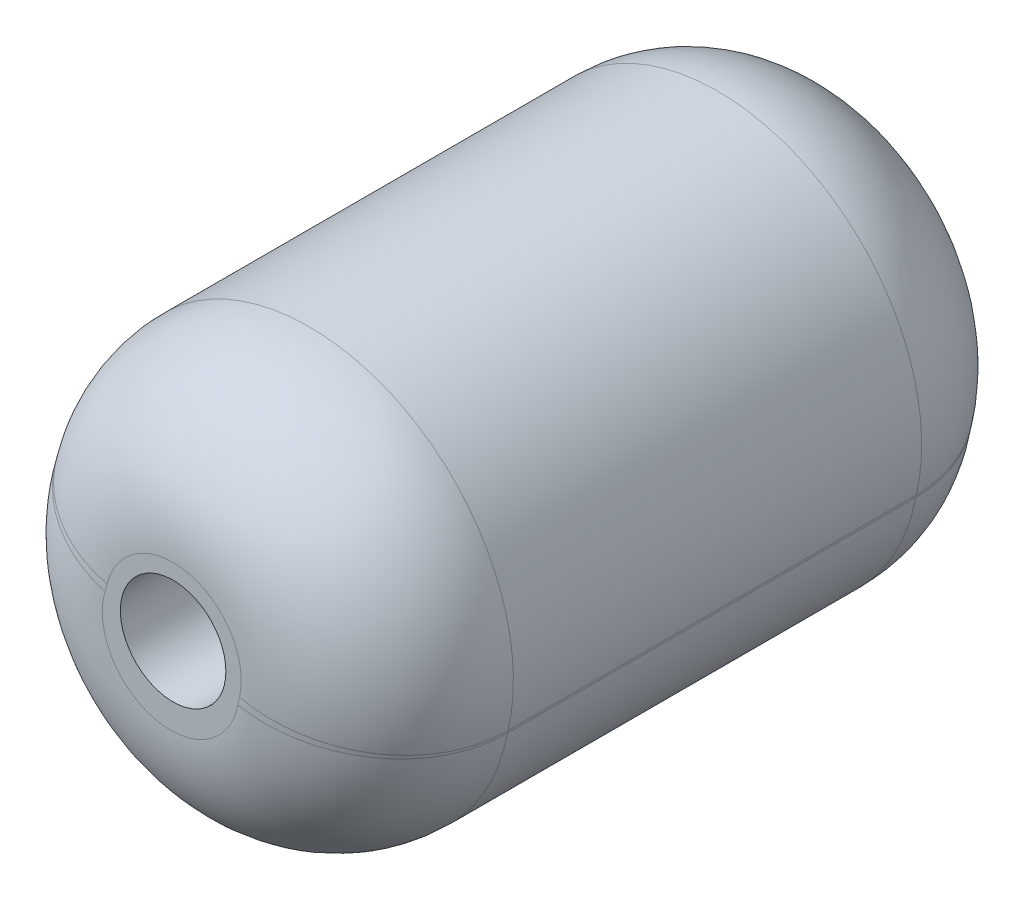
ISO-10303-21;
HEADER;
FILE_DESCRIPTION(('STEP AP214'),'2;1');
FILE_NAME('part.step','',(''),(''),'','','');
FILE_SCHEMA(('AUTOMOTIVE_DESIGN { 1 0 10303 214 1 1 1 1 }'));
ENDSEC;
DATA;
#1=APPLICATION_CONTEXT('core data for automotive mechanical design processes');
#2=APPLICATION_PROTOCOL_DEFINITION('international standard','automotive_design',2000,#1);
#3=PRODUCT_CONTEXT('',#1,'mechanical');
#4=PRODUCT('Part','Part','',(#3));
#5=PRODUCT_RELATED_PRODUCT_CATEGORY('part','',(#4));
#6=PRODUCT_DEFINITION_FORMATION('','',#4);
#7=PRODUCT_DEFINITION_CONTEXT('part definition',#1,'design');
#8=PRODUCT_DEFINITION('design','',#6,#7);
#9=PRODUCT_DEFINITION_SHAPE('','',#8);
#10=(LENGTH_UNIT() NAMED_UNIT(*) SI_UNIT(.MILLI.,.METRE.));
#11=(NAMED_UNIT(*) PLANE_ANGLE_UNIT() SI_UNIT($,.RADIAN.));
#12=(NAMED_UNIT(*) SI_UNIT($,.STERADIAN.) SOLID_ANGLE_UNIT());
#13=UNCERTAINTY_MEASURE_WITH_UNIT(LENGTH_MEASURE(1.E-05),#10,'distance_accuracy_value','');
#14=(GEOMETRIC_REPRESENTATION_CONTEXT(3) GLOBAL_UNCERTAINTY_ASSIGNED_CONTEXT((#13)) GLOBAL_UNIT_ASSIGNED_CONTEXT((#10,
#11,#12)) REPRESENTATION_CONTEXT('',''));
#15=CARTESIAN_POINT('',(0.,0.,0.));
#16=DIRECTION('',(0.,0.,1.));
#17=DIRECTION('',(1.,0.,0.));
#18=AXIS2_PLACEMENT_3D('',#15,#16,#17);
#19=CARTESIAN_POINT('',(24.0974538263622,23.7136767036447,30.));
#20=DIRECTION('',(0.,1.,0.));
#21=DIRECTION('',(1.,0.,0.));
#22=AXIS2_PLACEMENT_3D('',#19,#20,#21);
#23=CIRCLE('',#22,40.);
#24=TRIMMED_CURVE('',#23,(PARAMETER_VALUE(-2.0943951023932)),(PARAMETER_VALUE(2.0943951023932)),
.T.,.PARAMETER.);
#25=CARTESIAN_POINT('',(4.09745382636218,23.7136767036447,30.));
#26=DIRECTION('',(0.,0.,1.));
#27=AXIS1_PLACEMENT('',#25,#26);
#28=SURFACE_OF_REVOLUTION('',#24,#27);
#29=CARTESIAN_POINT('',(-15.3226545323034,28.4948262869234,30.));
#30=DIRECTION('',(0.239057479163932,0.971005417933281,0.));
#31=DIRECTION('',(0.971005417933281,-0.239057479163932,0.));
#32=AXIS2_PLACEMENT_3D('',#29,#30,#31);
#33=CIRCLE('',#32,40.);
#34=CARTESIAN_POINT('',(-15.3226545323035,28.4948262869234,70.));
#35=VERTEX_POINT('',#34);
#36=CARTESIAN_POINT('',(-54.1628712496347,38.0571254534807,30.));
#37=VERTEX_POINT('',#36);
#38=EDGE_CURVE('E211',#35,#37,#33,.F.);
#39=ORIENTED_EDGE('',*,*,#38,.F.);
#40=CARTESIAN_POINT('',(4.09745382636218,23.7136767036447,70.));
#41=DIRECTION('',(0.,0.,-1.));
#42=DIRECTION('',(-0.971005417933281,0.239057479163933,0.));
#43=AXIS2_PLACEMENT_3D('',#40,#41,#42);
#44=CIRCLE('',#43,20.);
#45=CARTESIAN_POINT('',(24.0974538263622,23.7136767036447,70.));
#46=VERTEX_POINT('',#45);
#47=EDGE_CURVE('E220',#46,#35,#44,.F.);
#48=ORIENTED_EDGE('',*,*,#47,.F.);
#49=CARTESIAN_POINT('',(4.09745382636218,23.7136767036447,70.));
#50=DIRECTION('',(0.,0.,-1.));
#51=DIRECTION('',(1.,0.,0.));
#52=AXIS2_PLACEMENT_3D('',#49,#50,#51);
#53=CIRCLE('',#52,20.);
#54=CARTESIAN_POINT('',(23.5772671964639,19.1819142356851,70.));
#55=VERTEX_POINT('',#54);
#56=EDGE_CURVE('E429',#55,#46,#53,.F.);
#57=ORIENTED_EDGE('',*,*,#56,.F.);
#58=CARTESIAN_POINT('',(23.5772671964639,19.1819142356851,30.));
#59=DIRECTION('',(-0.226588123397984,-0.973990668505084,0.));
#60=DIRECTION('',(-0.973990668505084,0.226588123397984,0.));
#61=AXIS2_PLACEMENT_3D('',#58,#59,#60);
#62=CIRCLE('',#61,40.);
#63=CARTESIAN_POINT('',(62.5368939366672,10.1183892997657,30.));
#64=VERTEX_POINT('',#63);
#65=EDGE_CURVE('E280',#64,#55,#62,.T.);
#66=ORIENTED_EDGE('',*,*,#65,.F.);
#67=CARTESIAN_POINT('',(4.09745382636218,23.7136767036447,30.));
#68=DIRECTION('',(0.,0.,1.));
#69=DIRECTION('',(1.,0.,0.));
#70=AXIS2_PLACEMENT_3D('',#67,#68,#69);
#71=CIRCLE('',#70,60.);
#72=EDGE_CURVE('E310',#37,#64,#71,.F.);
#73=ORIENTED_EDGE('',*,*,#72,.F.);
#74=EDGE_LOOP('',(#39,#48,#57,#66,#73));
#75=FACE_BOUND('',#74,.T.);
#76=ADVANCED_FACE('F16',(#75),#28,.F.);
#77=CARTESIAN_POINT('',(4.09745382636218,23.7136767036447,-130.));
#78=DIRECTION('',(0.,0.,1.));
#79=DIRECTION('',(1.,0.,0.));
#80=AXIS2_PLACEMENT_3D('',#77,#78,#79);
#81=CYLINDRICAL_SURFACE('',#80,15.4985056572607);
#82=CARTESIAN_POINT('',(4.09745382636218,23.7136767036447,-130.));
#83=DIRECTION('',(0.,0.,1.));
#84=DIRECTION('',(1.,0.,0.));
#85=AXIS2_PLACEMENT_3D('',#82,#83,#84);
#86=CIRCLE('',#85,15.4985056572607);
#87=CARTESIAN_POINT('',(19.5959594836228,23.7136767036447,-130.));
#88=VERTEX_POINT('',#87);
#89=EDGE_CURVE('E250',#88,#88,#86,.F.);
#90=ORIENTED_EDGE('',*,*,#89,.T.);
#91=EDGE_LOOP('',(#90));
#92=FACE_BOUND('',#91,.T.);
#93=CARTESIAN_POINT('',(4.09745382636218,23.7136767036447,70.));
#94=DIRECTION('',(0.,0.,1.));
#95=DIRECTION('',(1.,0.,0.));
#96=AXIS2_PLACEMENT_3D('',#93,#94,#95);
#97=CIRCLE('',#96,15.4985056572607);
#98=CARTESIAN_POINT('',(19.5959594836228,23.7136767036447,70.));
#99=VERTEX_POINT('',#98);
#100=EDGE_CURVE('E282',#99,#99,#97,.F.);
#101=ORIENTED_EDGE('',*,*,#100,.F.);
#102=EDGE_LOOP('',(#101));
#103=FACE_BOUND('',#102,.T.);
#104=ADVANCED_FACE('F424',(#92,#103),#81,.F.);
#105=CARTESIAN_POINT('',(24.0974538263622,23.7136767036447,-90.));
#106=DIRECTION('',(0.,1.,0.));
#107=DIRECTION('',(1.,0.,0.));
#108=AXIS2_PLACEMENT_3D('',#105,#106,#107);
#109=CIRCLE('',#108,40.);
#110=TRIMMED_CURVE('',#109,(PARAMETER_VALUE(-2.0943951023932)),
(PARAMETER_VALUE(2.0943951023932)),.T.,.PARAMETER.);
#111=CARTESIAN_POINT('',(4.09745382636218,23.7136767036447,-90.));
#112=DIRECTION('',(0.,0.,1.));
#113=AXIS1_PLACEMENT('',#111,#112);
#114=SURFACE_OF_REVOLUTION('',#110,#113);
#115=CARTESIAN_POINT('',(4.09745382636218,23.7136767036447,-90.));
#116=DIRECTION('',(0.,0.,1.));
#117=DIRECTION('',(1.,0.,0.));
#118=AXIS2_PLACEMENT_3D('',#115,#116,#117);
#119=CIRCLE('',#118,60.);
#120=CARTESIAN_POINT('',(62.5368939366672,10.1183892997657,-90.));
#121=VERTEX_POINT('',#120);
#122=CARTESIAN_POINT('',(-54.1628712496347,38.0571254534807,-90.));
#123=VERTEX_POINT('',#122);
#124=EDGE_CURVE('E307',#121,#123,#119,.T.);
#125=ORIENTED_EDGE('',*,*,#124,.F.);
#126=CARTESIAN_POINT('',(23.5772671964639,19.1819142356851,-90.));
#127=DIRECTION('',(-0.226588123397984,-0.973990668505084,0.));
#128=DIRECTION('',(-0.973990668505084,0.226588123397984,0.));
#129=AXIS2_PLACEMENT_3D('',#126,#127,#128);
#130=CIRCLE('',#129,40.);
#131=CARTESIAN_POINT('',(23.5772671964639,19.1819142356851,-130.));
#132=VERTEX_POINT('',#131);
#133=EDGE_CURVE('E100',#132,#121,#130,.T.);
#134=ORIENTED_EDGE('',*,*,#133,.F.);
#135=CARTESIAN_POINT('',(4.09745382636218,23.7136767036447,-130.));
#136=DIRECTION('',(0.,0.,1.));
#137=DIRECTION('',(0.973990668505084,-0.226588123397984,0.));
#138=AXIS2_PLACEMENT_3D('',#135,#136,#137);
#139=CIRCLE('',#138,20.);
#140=CARTESIAN_POINT('',(24.0974538263622,23.7136767036447,-130.));
#141=VERTEX_POINT('',#140);
#142=EDGE_CURVE('E92',#132,#141,#139,.T.);
#143=ORIENTED_EDGE('',*,*,#142,.T.);
#144=CARTESIAN_POINT('',(4.09745382636218,23.7136767036447,-130.));
#145=DIRECTION('',(0.,0.,1.));
#146=DIRECTION('',(1.,0.,0.));
#147=AXIS2_PLACEMENT_3D('',#144,#145,#146);
#148=CIRCLE('',#147,20.);
#149=CARTESIAN_POINT('',(-15.3226545323034,28.4948262869234,-130.));
#150=VERTEX_POINT('',#149);
#151=EDGE_CURVE('E96',#141,#150,#148,.T.);
#152=ORIENTED_EDGE('',*,*,#151,.T.);
#153=CARTESIAN_POINT('',(-15.3226545323034,28.4948262869234,-90.));
#154=DIRECTION('',(0.239057479163932,0.971005417933281,0.));
#155=DIRECTION('',(0.971005417933281,-0.239057479163932,0.));
#156=AXIS2_PLACEMENT_3D('',#153,#154,#155);
#157=CIRCLE('',#156,40.);
#158=EDGE_CURVE('E390',#123,#150,#157,.F.);
#159=ORIENTED_EDGE('',*,*,#158,.F.);
#160=EDGE_LOOP('',(#125,#134,#143,#152,#159));
#161=FACE_BOUND('',#160,.T.);
#162=ADVANCED_FACE('F95',(#161),#114,.F.);
#163=CARTESIAN_POINT('',(82.0167073067689,5.58662683180603,30.));
#164=DIRECTION('',(0.,0.,1.));
#165=DIRECTION('',(1.,0.,0.));
#166=AXIS2_PLACEMENT_3D('',#163,#164,#165);
#167=TOROIDAL_SURFACE('',#166,60.,40.);
#168=ORIENTED_EDGE('',*,*,#65,.T.);
#169=CARTESIAN_POINT('',(82.0167073067689,5.58662683180603,70.));
#170=DIRECTION('',(0.,0.,1.));
#171=DIRECTION('',(-0.973990668505084,0.226588123397984,0.));
#172=AXIS2_PLACEMENT_3D('',#169,#170,#171);
#173=CIRCLE('',#172,60.);
#174=CARTESIAN_POINT('',(23.0977232197931,16.9247622234254,70.));
#175=VERTEX_POINT('',#174);
#176=EDGE_CURVE('E245',#175,#55,#173,.F.);
#177=ORIENTED_EDGE('',*,*,#176,.F.);
#178=CARTESIAN_POINT('',(23.0977232197931,16.9247622234254,30.));
#179=DIRECTION('',(0.188968923193657,0.981983068116263,0.));
#180=DIRECTION('',(0.981983068116263,-0.188968923193657,0.));
#181=AXIS2_PLACEMENT_3D('',#178,#179,#180);
#182=CIRCLE('',#181,40.);
#183=CARTESIAN_POINT('',(62.3770459444436,9.36600529567912,30.));
#184=VERTEX_POINT('',#183);
#185=EDGE_CURVE('E287',#184,#175,#182,.F.);
#186=ORIENTED_EDGE('',*,*,#185,.F.);
#187=CARTESIAN_POINT('',(82.0167073067689,5.58662683180603,30.));
#188=DIRECTION('',(0.,0.,-1.));
#189=DIRECTION('',(-1.,0.,0.));
#190=AXIS2_PLACEMENT_3D('',#187,#188,#189);
#191=CIRCLE('',#190,20.);
#192=EDGE_CURVE('E269',#184,#64,#191,.T.);
#193=ORIENTED_EDGE('',*,*,#192,.T.);
#194=EDGE_LOOP('',(#168,#177,#186,#193));
#195=FACE_BOUND('',#194,.T.);
#196=ADVANCED_FACE('F252',(#195),#167,.T.);
#197=CARTESIAN_POINT('',(3.73898803558262,22.2163694030876,70.));
#198=DIRECTION('',(0.,0.,1.));
#199=DIRECTION('',(1.,0.,0.));
#200=AXIS2_PLACEMENT_3D('',#197,#198,#199);
#201=PLANE('',#200);
#202=ORIENTED_EDGE('',*,*,#47,.T.);
#203=CARTESIAN_POINT('',(-73.5829796083003,42.8382750367593,70.));
#204=DIRECTION('',(0.,0.,1.));
#205=DIRECTION('',(0.961095144978449,-0.276217527139127,0.));
#206=AXIS2_PLACEMENT_3D('',#203,#204,#205);
#207=CIRCLE('',#206,60.);
#208=CARTESIAN_POINT('',(-15.9172709095934,26.2652234084117,70.));
#209=VERTEX_POINT('',#208);
#210=EDGE_CURVE('E225',#209,#35,#207,.T.);
#211=ORIENTED_EDGE('',*,*,#210,.F.);
#212=CARTESIAN_POINT('',(3.38052224480305,20.7190621025305,70.));
#213=DIRECTION('',(0.,0.,-1.));
#214=DIRECTION('',(-1.,0.,0.));
#215=AXIS2_PLACEMENT_3D('',#212,#213,#214);
#216=CIRCLE('',#215,20.078962270514);
#217=CARTESIAN_POINT('',(-16.6984400257109,20.7190621025305,70.));
#218=VERTEX_POINT('',#217);
#219=EDGE_CURVE('E378',#218,#209,#216,.T.);
#220=ORIENTED_EDGE('',*,*,#219,.F.);
#221=CARTESIAN_POINT('',(3.38052224480305,20.7190621025305,70.));
#222=DIRECTION('',(0.,0.,-1.));
#223=DIRECTION('',(0.981983068116263,-0.188968923193657,0.));
#224=AXIS2_PLACEMENT_3D('',#221,#222,#223);
#225=CIRCLE('',#224,20.078962270514);
#226=EDGE_CURVE('E350',#175,#218,#225,.T.);
#227=ORIENTED_EDGE('',*,*,#226,.F.);
#228=ORIENTED_EDGE('',*,*,#176,.T.);
#229=ORIENTED_EDGE('',*,*,#56,.T.);
#230=EDGE_LOOP('',(#202,#211,#220,#227,#228,#229));
#231=FACE_BOUND('',#230,.T.);
#232=ORIENTED_EDGE('',*,*,#100,.T.);
#233=EDGE_LOOP('',(#232));
#234=FACE_BOUND('',#233,.T.);
#235=ADVANCED_FACE('F200',(#231,#234),#201,.T.);
#236=CARTESIAN_POINT('',(-73.5829796083003,42.8382750367593,30.));
#237=DIRECTION('',(0.,0.,1.));
#238=DIRECTION('',(1.,0.,0.));
#239=AXIS2_PLACEMENT_3D('',#236,#237,#238);
#240=TOROIDAL_SURFACE('',#239,60.,40.);
#241=CARTESIAN_POINT('',(-15.9172709095934,26.2652234084117,30.));
#242=DIRECTION('',(-0.276217527139127,-0.961095144978449,0.));
#243=DIRECTION('',(-0.961095144978449,0.276217527139127,0.));
#244=AXIS2_PLACEMENT_3D('',#241,#242,#243);
#245=CIRCLE('',#244,40.);
#246=CARTESIAN_POINT('',(-54.3610767087313,37.3139244939768,30.));
#247=VERTEX_POINT('',#246);
#248=EDGE_CURVE('E369',#209,#247,#245,.T.);
#249=ORIENTED_EDGE('',*,*,#248,.F.);
#250=ORIENTED_EDGE('',*,*,#210,.T.);
#251=ORIENTED_EDGE('',*,*,#38,.T.);
#252=CARTESIAN_POINT('',(-73.5829796083003,42.8382750367593,30.));
#253=DIRECTION('',(0.,0.,1.));
#254=DIRECTION('',(1.,0.,0.));
#255=AXIS2_PLACEMENT_3D('',#252,#253,#254);
#256=CIRCLE('',#255,20.);
#257=EDGE_CURVE('E219',#37,#247,#256,.F.);
#258=ORIENTED_EDGE('',*,*,#257,.T.);
#259=EDGE_LOOP('',(#249,#250,#251,#258));
#260=FACE_BOUND('',#259,.T.);
#261=ADVANCED_FACE('F195',(#260),#240,.T.);
#262=CARTESIAN_POINT('',(4.09745382636218,23.7136767036447,-130.));
#263=DIRECTION('',(0.,0.,1.));
#264=DIRECTION('',(1.,0.,0.));
#265=AXIS2_PLACEMENT_3D('',#262,#263,#264);
#266=CYLINDRICAL_SURFACE('',#265,60.);
#267=DIRECTION('',(0.,0.,-1.));
#268=VECTOR('',#267,1.);
#269=CARTESIAN_POINT('',(-54.1628712496347,38.0571254534807,-130.));
#270=LINE('',#269,#268);
#271=EDGE_CURVE('E184',#123,#37,#270,.F.);
#272=ORIENTED_EDGE('',*,*,#271,.T.);
#273=ORIENTED_EDGE('',*,*,#72,.T.);
#274=DIRECTION('',(0.,0.,-1.));
#275=VECTOR('',#274,1.);
#276=CARTESIAN_POINT('',(62.5368939366672,10.1183892997657,-130.));
#277=LINE('',#276,#275);
#278=EDGE_CURVE('E272',#64,#121,#277,.T.);
#279=ORIENTED_EDGE('',*,*,#278,.T.);
#280=ORIENTED_EDGE('',*,*,#124,.T.);
#281=EDGE_LOOP('',(#272,#273,#279,#280));
#282=FACE_BOUND('',#281,.T.);
#283=ADVANCED_FACE('F199',(#282),#266,.T.);
#284=CARTESIAN_POINT('',(-73.5829796083003,42.8382750367593,-90.));
#285=DIRECTION('',(0.,0.,1.));
#286=DIRECTION('',(1.,0.,0.));
#287=AXIS2_PLACEMENT_3D('',#284,#285,#286);
#288=TOROIDAL_SURFACE('',#287,60.,40.);
#289=ORIENTED_EDGE('',*,*,#158,.T.);
#290=CARTESIAN_POINT('',(-73.5829796083003,42.8382750367593,-130.));
#291=DIRECTION('',(0.,0.,-1.));
#292=DIRECTION('',(0.971005417933281,-0.239057479163932,0.));
#293=AXIS2_PLACEMENT_3D('',#290,#291,#292);
#294=CIRCLE('',#293,60.);
#295=CARTESIAN_POINT('',(-15.9172709095934,26.2652234084117,-130.));
#296=VERTEX_POINT('',#295);
#297=EDGE_CURVE('E104',#150,#296,#294,.T.);
#298=ORIENTED_EDGE('',*,*,#297,.T.);
#299=CARTESIAN_POINT('',(-15.9172709095934,26.2652234084117,-90.));
#300=DIRECTION('',(-0.276217527139127,-0.961095144978449,0.));
#301=DIRECTION('',(-0.961095144978449,0.276217527139127,0.));
#302=AXIS2_PLACEMENT_3D('',#299,#300,#301);
#303=CIRCLE('',#302,40.);
#304=CARTESIAN_POINT('',(-54.3610767087313,37.3139244939768,-90.));
#305=VERTEX_POINT('',#304);
#306=EDGE_CURVE('E37',#305,#296,#303,.T.);
#307=ORIENTED_EDGE('',*,*,#306,.F.);
#308=CARTESIAN_POINT('',(-73.5829796083003,42.8382750367593,-90.));
#309=DIRECTION('',(0.,0.,-1.));
#310=DIRECTION('',(-1.,0.,0.));
#311=AXIS2_PLACEMENT_3D('',#308,#309,#310);
#312=CIRCLE('',#311,20.);
#313=EDGE_CURVE('E377',#305,#123,#312,.F.);
#314=ORIENTED_EDGE('',*,*,#313,.T.);
#315=EDGE_LOOP('',(#289,#298,#307,#314));
#316=FACE_BOUND('',#315,.T.);
#317=ADVANCED_FACE('F132',(#316),#288,.T.);
#318=CARTESIAN_POINT('',(3.73898803558262,22.2163694030876,-130.));
#319=DIRECTION('',(0.,0.,1.));
#320=DIRECTION('',(1.,0.,0.));
#321=AXIS2_PLACEMENT_3D('',#318,#319,#320);
#322=PLANE('',#321);
#323=ORIENTED_EDGE('',*,*,#142,.F.);
#324=CARTESIAN_POINT('',(82.0167073067689,5.58662683180603,-130.));
#325=DIRECTION('',(0.,0.,-1.));
#326=DIRECTION('',(-0.981983068116263,0.188968923193656,0.));
#327=AXIS2_PLACEMENT_3D('',#324,#325,#326);
#328=CIRCLE('',#327,60.);
#329=CARTESIAN_POINT('',(23.0977232197931,16.9247622234254,-130.));
#330=VERTEX_POINT('',#329);
#331=EDGE_CURVE('E165',#330,#132,#328,.T.);
#332=ORIENTED_EDGE('',*,*,#331,.F.);
#333=CARTESIAN_POINT('',(3.38052224480305,20.7190621025305,-130.));
#334=DIRECTION('',(0.,0.,1.));
#335=DIRECTION('',(-1.,0.,0.));
#336=AXIS2_PLACEMENT_3D('',#333,#334,#335);
#337=CIRCLE('',#336,20.078962270514);
#338=CARTESIAN_POINT('',(-16.6984400257109,20.7190621025305,-130.));
#339=VERTEX_POINT('',#338);
#340=EDGE_CURVE('E167',#339,#330,#337,.T.);
#341=ORIENTED_EDGE('',*,*,#340,.F.);
#342=CARTESIAN_POINT('',(3.38052224480305,20.7190621025305,-130.));
#343=DIRECTION('',(0.,0.,1.));
#344=DIRECTION('',(-0.961095144978449,0.276217527139127,0.));
#345=AXIS2_PLACEMENT_3D('',#342,#343,#344);
#346=CIRCLE('',#345,20.078962270514);
#347=EDGE_CURVE('E181',#296,#339,#346,.T.);
#348=ORIENTED_EDGE('',*,*,#347,.F.);
#349=ORIENTED_EDGE('',*,*,#297,.F.);
#350=ORIENTED_EDGE('',*,*,#151,.F.);
#351=EDGE_LOOP('',(#323,#332,#341,#348,#349,#350));
#352=FACE_BOUND('',#351,.T.);
#353=ORIENTED_EDGE('',*,*,#89,.F.);
#354=EDGE_LOOP('',(#353));
#355=FACE_BOUND('',#354,.T.);
#356=ADVANCED_FACE('F108',(#352,#355),#322,.F.);
#357=CARTESIAN_POINT('',(82.0167073067689,5.58662683180603,-90.));
#358=DIRECTION('',(0.,0.,1.));
#359=DIRECTION('',(1.,0.,0.));
#360=AXIS2_PLACEMENT_3D('',#357,#358,#359);
#361=TOROIDAL_SURFACE('',#360,60.,40.);
#362=CARTESIAN_POINT('',(23.0977232197931,16.9247622234254,-90.));
#363=DIRECTION('',(0.188968923193656,0.981983068116263,0.));
#364=DIRECTION('',(0.981983068116263,-0.188968923193656,0.));
#365=AXIS2_PLACEMENT_3D('',#362,#363,#364);
#366=CIRCLE('',#365,40.);
#367=CARTESIAN_POINT('',(62.3770459444436,9.36600529567915,-90.));
#368=VERTEX_POINT('',#367);
#369=EDGE_CURVE('E173',#330,#368,#366,.F.);
#370=ORIENTED_EDGE('',*,*,#369,.F.);
#371=ORIENTED_EDGE('',*,*,#331,.T.);
#372=ORIENTED_EDGE('',*,*,#133,.T.);
#373=CARTESIAN_POINT('',(82.0167073067689,5.58662683180603,-90.));
#374=DIRECTION('',(0.,0.,-1.));
#375=DIRECTION('',(-1.,0.,0.));
#376=AXIS2_PLACEMENT_3D('',#373,#374,#375);
#377=CIRCLE('',#376,20.);
#378=EDGE_CURVE('E170',#121,#368,#377,.F.);
#379=ORIENTED_EDGE('',*,*,#378,.T.);
#380=EDGE_LOOP('',(#370,#371,#372,#379));
#381=FACE_BOUND('',#380,.T.);
#382=ADVANCED_FACE('F131',(#381),#361,.T.);
#383=CARTESIAN_POINT('',(82.0167073067689,5.58662683180603,-130.));
#384=DIRECTION('',(0.,0.,-1.));
#385=DIRECTION('',(-1.,0.,0.));
#386=AXIS2_PLACEMENT_3D('',#383,#384,#385);
#387=CYLINDRICAL_SURFACE('',#386,20.);
#388=ORIENTED_EDGE('',*,*,#192,.F.);
#389=DIRECTION('',(0.,0.,1.));
#390=VECTOR('',#389,1.);
#391=CARTESIAN_POINT('',(62.3770459444436,9.36600529567911,-130.));
#392=LINE('',#391,#390);
#393=EDGE_CURVE('E178',#368,#184,#392,.T.);
#394=ORIENTED_EDGE('',*,*,#393,.F.);
#395=ORIENTED_EDGE('',*,*,#378,.F.);
#396=ORIENTED_EDGE('',*,*,#278,.F.);
#397=EDGE_LOOP('',(#388,#394,#395,#396));
#398=FACE_BOUND('',#397,.T.);
#399=ADVANCED_FACE('F314',(#398),#387,.F.);
#400=CARTESIAN_POINT('',(23.459484515317,20.7190621025305,30.));
#401=DIRECTION('',(0.,1.,0.));
#402=DIRECTION('',(1.,0.,0.));
#403=AXIS2_PLACEMENT_3D('',#400,#401,#402);
#404=CIRCLE('',#403,40.);
#405=TRIMMED_CURVE('',#404,(PARAMETER_VALUE(-2.09667605067461)),
(PARAMETER_VALUE(2.09667605067461)),.T.,.PARAMETER.);
#406=CARTESIAN_POINT('',(3.38052224480305,20.7190621025305,30.));
#407=DIRECTION('',(0.,0.,1.));
#408=AXIS1_PLACEMENT('',#406,#407);
#409=SURFACE_OF_REVOLUTION('',#405,#408);
#410=ORIENTED_EDGE('',*,*,#219,.T.);
#411=ORIENTED_EDGE('',*,*,#248,.T.);
#412=CARTESIAN_POINT('',(3.38052224480305,20.7190621025305,30.));
#413=DIRECTION('',(0.,0.,1.));
#414=DIRECTION('',(1.,0.,0.));
#415=AXIS2_PLACEMENT_3D('',#412,#413,#414);
#416=CIRCLE('',#415,60.078962270514);
#417=EDGE_CURVE('E277',#184,#247,#416,.F.);
#418=ORIENTED_EDGE('',*,*,#417,.F.);
#419=ORIENTED_EDGE('',*,*,#185,.T.);
#420=ORIENTED_EDGE('',*,*,#226,.T.);
#421=EDGE_LOOP('',(#410,#411,#418,#419,#420));
#422=FACE_BOUND('',#421,.T.);
#423=ADVANCED_FACE('F354',(#422),#409,.F.);
#424=CARTESIAN_POINT('',(-73.5829796083003,42.8382750367593,-130.));
#425=DIRECTION('',(0.,0.,-1.));
#426=DIRECTION('',(-1.,0.,0.));
#427=AXIS2_PLACEMENT_3D('',#424,#425,#426);
#428=CYLINDRICAL_SURFACE('',#427,20.);
#429=ORIENTED_EDGE('',*,*,#257,.F.);
#430=ORIENTED_EDGE('',*,*,#271,.F.);
#431=ORIENTED_EDGE('',*,*,#313,.F.);
#432=DIRECTION('',(0.,0.,1.));
#433=VECTOR('',#432,1.);
#434=CARTESIAN_POINT('',(-54.3610767087313,37.3139244939768,-130.));
#435=LINE('',#434,#433);
#436=EDGE_CURVE('E28',#247,#305,#435,.F.);
#437=ORIENTED_EDGE('',*,*,#436,.F.);
#438=EDGE_LOOP('',(#429,#430,#431,#437));
#439=FACE_BOUND('',#438,.T.);
#440=ADVANCED_FACE('F332',(#439),#428,.F.);
#441=CARTESIAN_POINT('',(23.459484515317,20.7190621025305,-90.));
#442=DIRECTION('',(0.,1.,0.));
#443=DIRECTION('',(1.,0.,0.));
#444=AXIS2_PLACEMENT_3D('',#441,#442,#443);
#445=CIRCLE('',#444,40.);
#446=TRIMMED_CURVE('',#445,(PARAMETER_VALUE(-2.09667605067461)),
(PARAMETER_VALUE(2.09667605067461)),.T.,.PARAMETER.);
#447=CARTESIAN_POINT('',(3.38052224480305,20.7190621025305,-90.));
#448=DIRECTION('',(0.,0.,1.));
#449=AXIS1_PLACEMENT('',#447,#448);
#450=SURFACE_OF_REVOLUTION('',#446,#449);
#451=ORIENTED_EDGE('',*,*,#369,.T.);
#452=CARTESIAN_POINT('',(3.38052224480305,20.7190621025305,-90.));
#453=DIRECTION('',(0.,0.,1.));
#454=DIRECTION('',(1.,0.,0.));
#455=AXIS2_PLACEMENT_3D('',#452,#453,#454);
#456=CIRCLE('',#455,60.078962270514);
#457=EDGE_CURVE('E11',#305,#368,#456,.T.);
#458=ORIENTED_EDGE('',*,*,#457,.F.);
#459=ORIENTED_EDGE('',*,*,#306,.T.);
#460=ORIENTED_EDGE('',*,*,#347,.T.);
#461=ORIENTED_EDGE('',*,*,#340,.T.);
#462=EDGE_LOOP('',(#451,#458,#459,#460,#461));
#463=FACE_BOUND('',#462,.T.);
#464=ADVANCED_FACE('F180',(#463),#450,.F.);
#465=CARTESIAN_POINT('',(3.38052224480305,20.7190621025305,-130.));
#466=DIRECTION('',(0.,0.,1.));
#467=DIRECTION('',(1.,0.,0.));
#468=AXIS2_PLACEMENT_3D('',#465,#466,#467);
#469=CYLINDRICAL_SURFACE('',#468,60.078962270514);
#470=ORIENTED_EDGE('',*,*,#457,.T.);
#471=ORIENTED_EDGE('',*,*,#393,.T.);
#472=ORIENTED_EDGE('',*,*,#417,.T.);
#473=ORIENTED_EDGE('',*,*,#436,.T.);
#474=EDGE_LOOP('',(#470,#471,#472,#473));
#475=FACE_BOUND('',#474,.T.);
#476=ADVANCED_FACE('F317',(#475),#469,.T.);
#477=CLOSED_SHELL('',(#76,#104,#162,#196,#235,#261,#283,#317,#356,#382,#399,#423,#440,#464,#476));
#478=MANIFOLD_SOLID_BREP('B1',#477);
#479=ADVANCED_BREP_SHAPE_REPRESENTATION('',(#18,#478),#14);
#480=SHAPE_DEFINITION_REPRESENTATION(#9,#479);
ENDSEC;
END-ISO-10303-21;
